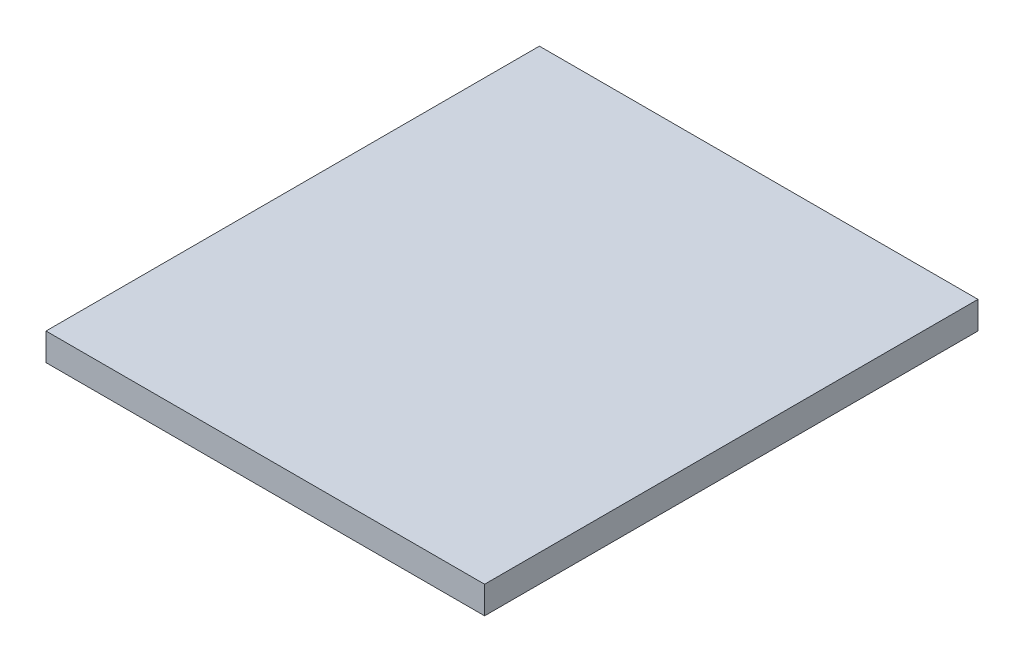
ISO-10303-21;
HEADER;
FILE_DESCRIPTION(('STEP AP214'),'2;1');
FILE_NAME('part.step','',(''),(''),'','','');
FILE_SCHEMA(('AUTOMOTIVE_DESIGN { 1 0 10303 214 1 1 1 1 }'));
ENDSEC;
DATA;
#1=APPLICATION_CONTEXT('core data for automotive mechanical design processes');
#2=APPLICATION_PROTOCOL_DEFINITION('international standard','automotive_design',2000,#1);
#3=PRODUCT_CONTEXT('',#1,'mechanical');
#4=PRODUCT('Part','Part','',(#3));
#5=PRODUCT_RELATED_PRODUCT_CATEGORY('part','',(#4));
#6=PRODUCT_DEFINITION_FORMATION('','',#4);
#7=PRODUCT_DEFINITION_CONTEXT('part definition',#1,'design');
#8=PRODUCT_DEFINITION('design','',#6,#7);
#9=PRODUCT_DEFINITION_SHAPE('','',#8);
#10=(LENGTH_UNIT() NAMED_UNIT(*) SI_UNIT(.MILLI.,.METRE.));
#11=(NAMED_UNIT(*) PLANE_ANGLE_UNIT() SI_UNIT($,.RADIAN.));
#12=(NAMED_UNIT(*) SI_UNIT($,.STERADIAN.) SOLID_ANGLE_UNIT());
#13=UNCERTAINTY_MEASURE_WITH_UNIT(LENGTH_MEASURE(1.E-05),#10,'distance_accuracy_value','');
#14=(GEOMETRIC_REPRESENTATION_CONTEXT(3) GLOBAL_UNCERTAINTY_ASSIGNED_CONTEXT((#13)) GLOBAL_UNIT_ASSIGNED_CONTEXT((#10,
#11,#12)) REPRESENTATION_CONTEXT('',''));
#15=CARTESIAN_POINT('',(0.,0.,0.));
#16=DIRECTION('',(0.,0.,1.));
#17=DIRECTION('',(1.,0.,0.));
#18=AXIS2_PLACEMENT_3D('',#15,#16,#17);
#19=CARTESIAN_POINT('',(0.,3.175,0.));
#20=DIRECTION('',(1.,0.,0.));
#21=DIRECTION('',(0.,0.,-1.));
#22=AXIS2_PLACEMENT_3D('',#19,#20,#21);
#23=PLANE('',#22);
#24=DIRECTION('',(0.,0.,1.));
#25=VECTOR('',#24,1.);
#26=CARTESIAN_POINT('',(0.,0.,0.));
#27=LINE('',#26,#25);
#28=CARTESIAN_POINT('',(0.,0.,-57.15));
#29=VERTEX_POINT('',#28);
#30=CARTESIAN_POINT('',(0.,0.,0.));
#31=VERTEX_POINT('',#30);
#32=EDGE_CURVE('E98',#29,#31,#27,.T.);
#33=ORIENTED_EDGE('',*,*,#32,.T.);
#34=DIRECTION('',(0.,-1.,0.));
#35=VECTOR('',#34,1.);
#36=CARTESIAN_POINT('',(0.,3.175,0.));
#37=LINE('',#36,#35);
#38=CARTESIAN_POINT('',(0.,3.175,0.));
#39=VERTEX_POINT('',#38);
#40=EDGE_CURVE('E11',#39,#31,#37,.T.);
#41=ORIENTED_EDGE('',*,*,#40,.F.);
#42=DIRECTION('',(0.,0.,1.));
#43=VECTOR('',#42,1.);
#44=CARTESIAN_POINT('',(0.,3.175,0.));
#45=LINE('',#44,#43);
#46=CARTESIAN_POINT('',(0.,3.175,-57.15));
#47=VERTEX_POINT('',#46);
#48=EDGE_CURVE('E86',#47,#39,#45,.T.);
#49=ORIENTED_EDGE('',*,*,#48,.F.);
#50=DIRECTION('',(0.,-1.,0.));
#51=VECTOR('',#50,1.);
#52=CARTESIAN_POINT('',(0.,3.175,-57.15));
#53=LINE('',#52,#51);
#54=EDGE_CURVE('E94',#47,#29,#53,.T.);
#55=ORIENTED_EDGE('',*,*,#54,.T.);
#56=EDGE_LOOP('',(#33,#41,#49,#55));
#57=FACE_BOUND('',#56,.T.);
#58=ADVANCED_FACE('F35',(#57),#23,.F.);
#59=CARTESIAN_POINT('',(0.,3.175,0.));
#60=DIRECTION('',(0.,0.,-1.));
#61=DIRECTION('',(-1.,0.,0.));
#62=AXIS2_PLACEMENT_3D('',#59,#60,#61);
#63=PLANE('',#62);
#64=DIRECTION('',(1.,0.,0.));
#65=VECTOR('',#64,1.);
#66=CARTESIAN_POINT('',(0.,0.,0.));
#67=LINE('',#66,#65);
#68=CARTESIAN_POINT('',(50.8,0.,0.));
#69=VERTEX_POINT('',#68);
#70=EDGE_CURVE('E90',#31,#69,#67,.T.);
#71=ORIENTED_EDGE('',*,*,#70,.T.);
#72=DIRECTION('',(0.,-1.,0.));
#73=VECTOR('',#72,1.);
#74=CARTESIAN_POINT('',(50.8,3.175,0.));
#75=LINE('',#74,#73);
#76=CARTESIAN_POINT('',(50.8,3.175,0.));
#77=VERTEX_POINT('',#76);
#78=EDGE_CURVE('E43',#77,#69,#75,.T.);
#79=ORIENTED_EDGE('',*,*,#78,.F.);
#80=DIRECTION('',(1.,0.,0.));
#81=VECTOR('',#80,1.);
#82=CARTESIAN_POINT('',(0.,3.175,0.));
#83=LINE('',#82,#81);
#84=EDGE_CURVE('E81',#39,#77,#83,.T.);
#85=ORIENTED_EDGE('',*,*,#84,.F.);
#86=ORIENTED_EDGE('',*,*,#40,.T.);
#87=EDGE_LOOP('',(#71,#79,#85,#86));
#88=FACE_BOUND('',#87,.T.);
#89=ADVANCED_FACE('F89',(#88),#63,.F.);
#90=CARTESIAN_POINT('',(50.8,3.175,0.));
#91=DIRECTION('',(-1.,0.,0.));
#92=DIRECTION('',(0.,0.,1.));
#93=AXIS2_PLACEMENT_3D('',#90,#91,#92);
#94=PLANE('',#93);
#95=DIRECTION('',(0.,0.,-1.));
#96=VECTOR('',#95,1.);
#97=CARTESIAN_POINT('',(50.8,0.,0.));
#98=LINE('',#97,#96);
#99=CARTESIAN_POINT('',(50.8,0.,-57.15));
#100=VERTEX_POINT('',#99);
#101=EDGE_CURVE('E68',#69,#100,#98,.T.);
#102=ORIENTED_EDGE('',*,*,#101,.T.);
#103=DIRECTION('',(0.,-1.,0.));
#104=VECTOR('',#103,1.);
#105=CARTESIAN_POINT('',(50.8,3.175,-57.15));
#106=LINE('',#105,#104);
#107=CARTESIAN_POINT('',(50.8,3.175,-57.15));
#108=VERTEX_POINT('',#107);
#109=EDGE_CURVE('E91',#108,#100,#106,.T.);
#110=ORIENTED_EDGE('',*,*,#109,.F.);
#111=DIRECTION('',(0.,0.,-1.));
#112=VECTOR('',#111,1.);
#113=CARTESIAN_POINT('',(50.8,3.175,0.));
#114=LINE('',#113,#112);
#115=EDGE_CURVE('E84',#77,#108,#114,.T.);
#116=ORIENTED_EDGE('',*,*,#115,.F.);
#117=ORIENTED_EDGE('',*,*,#78,.T.);
#118=EDGE_LOOP('',(#102,#110,#116,#117));
#119=FACE_BOUND('',#118,.T.);
#120=ADVANCED_FACE('F92',(#119),#94,.F.);
#121=CARTESIAN_POINT('',(0.,3.175,-57.15));
#122=DIRECTION('',(0.,0.,1.));
#123=DIRECTION('',(1.,0.,0.));
#124=AXIS2_PLACEMENT_3D('',#121,#122,#123);
#125=PLANE('',#124);
#126=DIRECTION('',(-1.,0.,0.));
#127=VECTOR('',#126,1.);
#128=CARTESIAN_POINT('',(0.,0.,-57.15));
#129=LINE('',#128,#127);
#130=EDGE_CURVE('E74',#100,#29,#129,.T.);
#131=ORIENTED_EDGE('',*,*,#130,.T.);
#132=ORIENTED_EDGE('',*,*,#54,.F.);
#133=DIRECTION('',(-1.,0.,0.));
#134=VECTOR('',#133,1.);
#135=CARTESIAN_POINT('',(0.,3.175,-57.15));
#136=LINE('',#135,#134);
#137=EDGE_CURVE('E51',#108,#47,#136,.T.);
#138=ORIENTED_EDGE('',*,*,#137,.F.);
#139=ORIENTED_EDGE('',*,*,#109,.T.);
#140=EDGE_LOOP('',(#131,#132,#138,#139));
#141=FACE_BOUND('',#140,.T.);
#142=ADVANCED_FACE('F105',(#141),#125,.F.);
#143=CARTESIAN_POINT('',(0.,3.175,0.));
#144=DIRECTION('',(0.,-1.,0.));
#145=DIRECTION('',(0.,0.,-1.));
#146=AXIS2_PLACEMENT_3D('',#143,#144,#145);
#147=PLANE('',#146);
#148=ORIENTED_EDGE('',*,*,#48,.T.);
#149=ORIENTED_EDGE('',*,*,#84,.T.);
#150=ORIENTED_EDGE('',*,*,#115,.T.);
#151=ORIENTED_EDGE('',*,*,#137,.T.);
#152=EDGE_LOOP('',(#148,#149,#150,#151));
#153=FACE_BOUND('',#152,.T.);
#154=ADVANCED_FACE('F82',(#153),#147,.F.);
#155=CARTESIAN_POINT('',(0.,0.,0.));
#156=DIRECTION('',(0.,-1.,0.));
#157=DIRECTION('',(0.,0.,-1.));
#158=AXIS2_PLACEMENT_3D('',#155,#156,#157);
#159=PLANE('',#158);
#160=ORIENTED_EDGE('',*,*,#32,.F.);
#161=ORIENTED_EDGE('',*,*,#130,.F.);
#162=ORIENTED_EDGE('',*,*,#101,.F.);
#163=ORIENTED_EDGE('',*,*,#70,.F.);
#164=EDGE_LOOP('',(#160,#161,#162,#163));
#165=FACE_BOUND('',#164,.T.);
#166=ADVANCED_FACE('F108',(#165),#159,.T.);
#167=CLOSED_SHELL('',(#58,#89,#120,#142,#154,#166));
#168=MANIFOLD_SOLID_BREP('B2',#167);
#169=ADVANCED_BREP_SHAPE_REPRESENTATION('',(#18,#168),#14);
#170=SHAPE_DEFINITION_REPRESENTATION(#9,#169);
ENDSEC;
END-ISO-10303-21;
